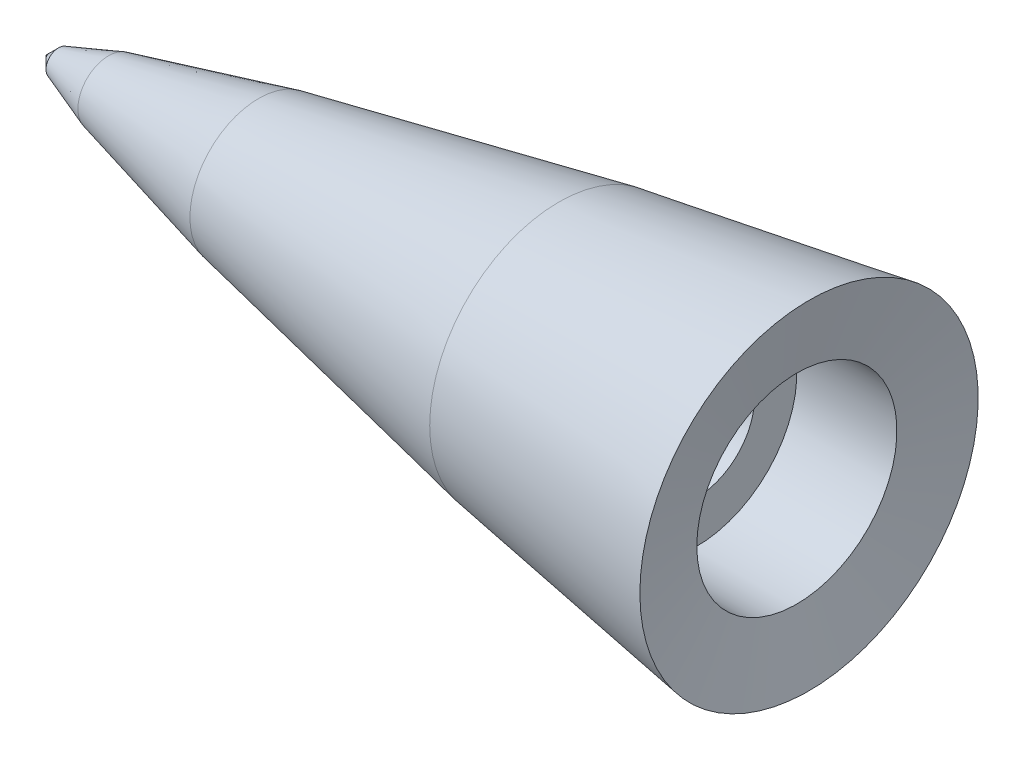
ISO-10303-21;
HEADER;
FILE_DESCRIPTION(('STEP AP214'),'2;1');
FILE_NAME('part.step','',(''),(''),'','','');
FILE_SCHEMA(('AUTOMOTIVE_DESIGN { 1 0 10303 214 1 1 1 1 }'));
ENDSEC;
DATA;
#1=APPLICATION_CONTEXT('core data for automotive mechanical design processes');
#2=APPLICATION_PROTOCOL_DEFINITION('international standard','automotive_design',2000,#1);
#3=PRODUCT_CONTEXT('',#1,'mechanical');
#4=PRODUCT('Part','Part','',(#3));
#5=PRODUCT_RELATED_PRODUCT_CATEGORY('part','',(#4));
#6=PRODUCT_DEFINITION_FORMATION('','',#4);
#7=PRODUCT_DEFINITION_CONTEXT('part definition',#1,'design');
#8=PRODUCT_DEFINITION('design','',#6,#7);
#9=PRODUCT_DEFINITION_SHAPE('','',#8);
#10=(LENGTH_UNIT() NAMED_UNIT(*) SI_UNIT(.MILLI.,.METRE.));
#11=(NAMED_UNIT(*) PLANE_ANGLE_UNIT() SI_UNIT($,.RADIAN.));
#12=(NAMED_UNIT(*) SI_UNIT($,.STERADIAN.) SOLID_ANGLE_UNIT());
#13=UNCERTAINTY_MEASURE_WITH_UNIT(LENGTH_MEASURE(1.E-05),#10,'distance_accuracy_value','');
#14=(GEOMETRIC_REPRESENTATION_CONTEXT(3) GLOBAL_UNCERTAINTY_ASSIGNED_CONTEXT((#13)) GLOBAL_UNIT_ASSIGNED_CONTEXT((#10,
#11,#12)) REPRESENTATION_CONTEXT('',''));
#15=CARTESIAN_POINT('',(0.,0.,0.));
#16=DIRECTION('',(0.,0.,1.));
#17=DIRECTION('',(1.,0.,0.));
#18=AXIS2_PLACEMENT_3D('',#15,#16,#17);
#19=CARTESIAN_POINT('',(0.,0.,0.));
#20=DIRECTION('',(-1.,0.,0.));
#21=DIRECTION('',(0.,0.,1.));
#22=AXIS2_PLACEMENT_3D('',#19,#20,#21);
#23=CYLINDRICAL_SURFACE('',#22,12.6999999999991);
#24=CARTESIAN_POINT('',(96.6194053925777,0.,0.));
#25=DIRECTION('',(-1.,0.,0.));
#26=DIRECTION('',(0.,0.,1.));
#27=AXIS2_PLACEMENT_3D('',#24,#25,#26);
#28=CIRCLE('',#27,12.6999999999991);
#29=CARTESIAN_POINT('',(96.6194053925777,0.,12.6999999999991));
#30=VERTEX_POINT('',#29);
#31=EDGE_CURVE('E44',#30,#30,#28,.T.);
#32=ORIENTED_EDGE('',*,*,#31,.F.);
#33=EDGE_LOOP('',(#32));
#34=FACE_BOUND('',#33,.T.);
#35=CARTESIAN_POINT('',(83.9194053925777,0.,0.));
#36=DIRECTION('',(-1.,0.,0.));
#37=DIRECTION('',(0.,0.,1.));
#38=AXIS2_PLACEMENT_3D('',#35,#36,#37);
#39=CIRCLE('',#38,12.6999999999991);
#40=CARTESIAN_POINT('',(83.9194053925777,0.,12.6999999999991));
#41=VERTEX_POINT('',#40);
#42=EDGE_CURVE('E11',#41,#41,#39,.T.);
#43=ORIENTED_EDGE('',*,*,#42,.T.);
#44=EDGE_LOOP('',(#43));
#45=FACE_BOUND('',#44,.T.);
#46=ADVANCED_FACE('F37',(#34,#45),#23,.F.);
#47=CARTESIAN_POINT('',(96.6194053925777,0.,0.));
#48=DIRECTION('',(1.,0.,0.));
#49=DIRECTION('',(0.,0.,-1.));
#50=AXIS2_PLACEMENT_3D('',#47,#48,#49);
#51=CONICAL_SURFACE('',#50,12.6999999999991,1.39626340127345);
#52=CARTESIAN_POINT('',(98.1654285822372,0.,0.));
#53=DIRECTION('',(-1.,0.,0.));
#54=DIRECTION('',(0.,0.,1.));
#55=AXIS2_PLACEMENT_3D('',#52,#53,#54);
#56=CIRCLE('',#55,21.4679331917127);
#57=CARTESIAN_POINT('',(98.1654285822372,0.,21.4679331917127));
#58=VERTEX_POINT('',#57);
#59=EDGE_CURVE('E76',#58,#58,#56,.T.);
#60=ORIENTED_EDGE('',*,*,#59,.F.);
#61=EDGE_LOOP('',(#60));
#62=FACE_BOUND('',#61,.T.);
#63=ORIENTED_EDGE('',*,*,#31,.T.);
#64=EDGE_LOOP('',(#63));
#65=FACE_BOUND('',#64,.T.);
#66=ADVANCED_FACE('F81',(#62,#65),#51,.F.);
#67=CARTESIAN_POINT('',(83.9194053925777,0.,-7.68858));
#68=DIRECTION('',(-1.,0.,0.));
#69=DIRECTION('',(0.,0.,1.));
#70=AXIS2_PLACEMENT_3D('',#67,#68,#69);
#71=PLANE('',#70);
#72=CARTESIAN_POINT('',(83.9194053925777,0.,0.));
#73=DIRECTION('',(1.,0.,0.));
#74=DIRECTION('',(0.,0.,-1.));
#75=AXIS2_PLACEMENT_3D('',#72,#73,#74);
#76=CIRCLE('',#75,7.34186999999999);
#77=CARTESIAN_POINT('',(83.9194053925777,0.,-7.34186999999999));
#78=VERTEX_POINT('',#77);
#79=EDGE_CURVE('E70',#78,#78,#76,.T.);
#80=ORIENTED_EDGE('',*,*,#79,.F.);
#81=EDGE_LOOP('',(#80));
#82=FACE_BOUND('',#81,.T.);
#83=ORIENTED_EDGE('',*,*,#42,.F.);
#84=EDGE_LOOP('',(#83));
#85=FACE_BOUND('',#84,.T.);
#86=ADVANCED_FACE('F87',(#82,#85),#71,.F.);
#87=CARTESIAN_POINT('',(55.9794053925777,0.,0.));
#88=DIRECTION('',(1.,0.,0.));
#89=DIRECTION('',(0.,0.,-1.));
#90=AXIS2_PLACEMENT_3D('',#87,#88,#89);
#91=CONICAL_SURFACE('',#90,7.34186999999999,1.02974425867665);
#92=CARTESIAN_POINT('',(51.5679648395578,0.,0.));
#93=VERTEX_POINT('',#92);
#94=VERTEX_LOOP('',#93);
#95=FACE_BOUND('',#94,.T.);
#96=CARTESIAN_POINT('',(55.9794053925777,0.,0.));
#97=DIRECTION('',(1.,0.,0.));
#98=DIRECTION('',(0.,0.,-1.));
#99=AXIS2_PLACEMENT_3D('',#96,#97,#98);
#100=CIRCLE('',#99,7.34186999999999);
#101=CARTESIAN_POINT('',(55.9794053925777,0.,-7.34186999999999));
#102=VERTEX_POINT('',#101);
#103=EDGE_CURVE('E73',#102,#102,#100,.T.);
#104=ORIENTED_EDGE('',*,*,#103,.T.);
#105=EDGE_LOOP('',(#104));
#106=FACE_BOUND('',#105,.T.);
#107=ADVANCED_FACE('F89',(#95,#106),#91,.F.);
#108=CARTESIAN_POINT('',(83.9194053925777,0.,0.));
#109=DIRECTION('',(1.,0.,0.));
#110=DIRECTION('',(0.,0.,-1.));
#111=AXIS2_PLACEMENT_3D('',#108,#109,#110);
#112=CYLINDRICAL_SURFACE('',#111,7.34186999999999);
#113=ORIENTED_EDGE('',*,*,#103,.F.);
#114=EDGE_LOOP('',(#113));
#115=FACE_BOUND('',#114,.T.);
#116=ORIENTED_EDGE('',*,*,#79,.T.);
#117=EDGE_LOOP('',(#116));
#118=FACE_BOUND('',#117,.T.);
#119=ADVANCED_FACE('F96',(#115,#118),#112,.F.);
#120=CARTESIAN_POINT('',(66.4154285822372,0.,0.));
#121=DIRECTION('',(1.,0.,0.));
#122=DIRECTION('',(0.,0.,-1.));
#123=AXIS2_PLACEMENT_3D('',#120,#121,#122);
#124=CONICAL_SURFACE('',#123,16.3925551733488,0.198581124540139);
#125=CARTESIAN_POINT('',(28.3154285822372,0.,0.));
#126=DIRECTION('',(-1.,0.,0.));
#127=DIRECTION('',(0.,0.,1.));
#128=AXIS2_PLACEMENT_3D('',#125,#126,#127);
#129=CIRCLE('',#128,8.72556719458942);
#130=CARTESIAN_POINT('',(28.3154285822372,0.,8.72556719458942));
#131=VERTEX_POINT('',#130);
#132=EDGE_CURVE('E62',#131,#131,#129,.T.);
#133=ORIENTED_EDGE('',*,*,#132,.F.);
#134=EDGE_LOOP('',(#133));
#135=FACE_BOUND('',#134,.T.);
#136=CARTESIAN_POINT('',(66.4154285822372,0.,0.));
#137=DIRECTION('',(-1.,0.,0.));
#138=DIRECTION('',(0.,0.,1.));
#139=AXIS2_PLACEMENT_3D('',#136,#137,#138);
#140=CIRCLE('',#139,16.3925551733488);
#141=CARTESIAN_POINT('',(66.4154285822372,0.,16.3925551733488));
#142=VERTEX_POINT('',#141);
#143=EDGE_CURVE('E67',#142,#142,#140,.T.);
#144=ORIENTED_EDGE('',*,*,#143,.T.);
#145=EDGE_LOOP('',(#144));
#146=FACE_BOUND('',#145,.T.);
#147=ADVANCED_FACE('F104',(#135,#146),#124,.T.);
#148=CARTESIAN_POINT('',(28.3154285822372,0.,0.));
#149=DIRECTION('',(1.,0.,0.));
#150=DIRECTION('',(0.,0.,-1.));
#151=AXIS2_PLACEMENT_3D('',#148,#149,#150);
#152=CONICAL_SURFACE('',#151,8.72556719458942,0.248626631435889);
#153=CARTESIAN_POINT('',(9.26542858223722,0.,0.));
#154=DIRECTION('',(-1.,0.,0.));
#155=DIRECTION('',(0.,0.,1.));
#156=AXIS2_PLACEMENT_3D('',#153,#154,#155);
#157=CIRCLE('',#156,3.88916230752879);
#158=CARTESIAN_POINT('',(9.26542858223722,0.,3.88916230752879));
#159=VERTEX_POINT('',#158);
#160=EDGE_CURVE('E59',#159,#159,#157,.T.);
#161=ORIENTED_EDGE('',*,*,#160,.F.);
#162=EDGE_LOOP('',(#161));
#163=FACE_BOUND('',#162,.T.);
#164=ORIENTED_EDGE('',*,*,#132,.T.);
#165=EDGE_LOOP('',(#164));
#166=FACE_BOUND('',#165,.T.);
#167=ADVANCED_FACE('F109',(#163,#166),#152,.T.);
#168=CARTESIAN_POINT('',(98.1654285822372,0.,0.));
#169=DIRECTION('',(1.,0.,0.));
#170=DIRECTION('',(0.,0.,-1.));
#171=AXIS2_PLACEMENT_3D('',#168,#169,#170);
#172=CONICAL_SURFACE('',#171,21.4679331917127,0.158513318416981);
#173=ORIENTED_EDGE('',*,*,#143,.F.);
#174=EDGE_LOOP('',(#173));
#175=FACE_BOUND('',#174,.T.);
#176=ORIENTED_EDGE('',*,*,#59,.T.);
#177=EDGE_LOOP('',(#176));
#178=FACE_BOUND('',#177,.T.);
#179=ADVANCED_FACE('F106',(#175,#178),#172,.T.);
#180=CARTESIAN_POINT('',(9.26542858223722,0.,0.));
#181=DIRECTION('',(1.,0.,0.));
#182=DIRECTION('',(0.,0.,-1.));
#183=AXIS2_PLACEMENT_3D('',#180,#181,#182);
#184=CONICAL_SURFACE('',#183,3.88916230752879,0.347263973785251);
#185=CARTESIAN_POINT('',(2.91542858223722,0.,0.));
#186=DIRECTION('',(-1.,0.,0.));
#187=DIRECTION('',(0.,0.,1.));
#188=AXIS2_PLACEMENT_3D('',#185,#186,#187);
#189=CIRCLE('',#188,1.59090051822171);
#190=CARTESIAN_POINT('',(2.91542858223722,0.,1.59090051822171));
#191=VERTEX_POINT('',#190);
#192=EDGE_CURVE('E57',#191,#191,#189,.T.);
#193=ORIENTED_EDGE('',*,*,#192,.F.);
#194=EDGE_LOOP('',(#193));
#195=FACE_BOUND('',#194,.T.);
#196=ORIENTED_EDGE('',*,*,#160,.T.);
#197=EDGE_LOOP('',(#196));
#198=FACE_BOUND('',#197,.T.);
#199=ADVANCED_FACE('F53',(#195,#198),#184,.T.);
#200=CARTESIAN_POINT('',(2.91542858223722,0.,0.));
#201=DIRECTION('',(1.,0.,0.));
#202=DIRECTION('',(0.,0.,-1.));
#203=AXIS2_PLACEMENT_3D('',#200,#201,#202);
#204=CONICAL_SURFACE('',#203,1.59090051822171,0.785398163397448);
#205=CARTESIAN_POINT('',(1.32452806401551,0.,0.));
#206=VERTEX_POINT('',#205);
#207=VERTEX_LOOP('',#206);
#208=FACE_BOUND('',#207,.T.);
#209=ORIENTED_EDGE('',*,*,#192,.T.);
#210=EDGE_LOOP('',(#209));
#211=FACE_BOUND('',#210,.T.);
#212=ADVANCED_FACE('F50',(#208,#211),#204,.T.);
#213=CLOSED_SHELL('',(#46,#66,#86,#107,#119,#147,#167,#179,#199,#212));
#214=MANIFOLD_SOLID_BREP('B2',#213);
#215=ADVANCED_BREP_SHAPE_REPRESENTATION('',(#18,#214),#14);
#216=SHAPE_DEFINITION_REPRESENTATION(#9,#215);
ENDSEC;
END-ISO-10303-21;
